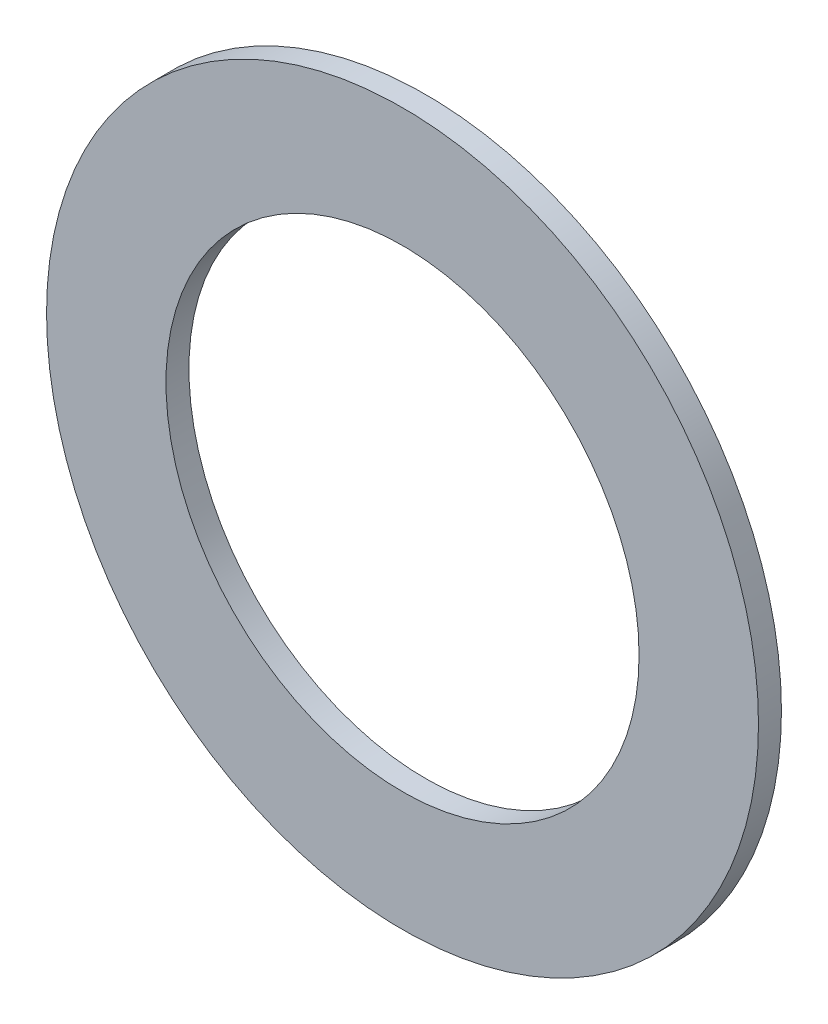
ISO-10303-21;
HEADER;
FILE_DESCRIPTION(('STEP AP214'),'2;1');
FILE_NAME('part.step','',(''),(''),'','','');
FILE_SCHEMA(('AUTOMOTIVE_DESIGN { 1 0 10303 214 1 1 1 1 }'));
ENDSEC;
DATA;
#1=APPLICATION_CONTEXT('core data for automotive mechanical design processes');
#2=APPLICATION_PROTOCOL_DEFINITION('international standard','automotive_design',2000,#1);
#3=PRODUCT_CONTEXT('',#1,'mechanical');
#4=PRODUCT('Part','Part','',(#3));
#5=PRODUCT_RELATED_PRODUCT_CATEGORY('part','',(#4));
#6=PRODUCT_DEFINITION_FORMATION('','',#4);
#7=PRODUCT_DEFINITION_CONTEXT('part definition',#1,'design');
#8=PRODUCT_DEFINITION('design','',#6,#7);
#9=PRODUCT_DEFINITION_SHAPE('','',#8);
#10=(LENGTH_UNIT() NAMED_UNIT(*) SI_UNIT(.MILLI.,.METRE.));
#11=(NAMED_UNIT(*) PLANE_ANGLE_UNIT() SI_UNIT($,.RADIAN.));
#12=(NAMED_UNIT(*) SI_UNIT($,.STERADIAN.) SOLID_ANGLE_UNIT());
#13=UNCERTAINTY_MEASURE_WITH_UNIT(LENGTH_MEASURE(1.E-05),#10,'distance_accuracy_value','');
#14=(GEOMETRIC_REPRESENTATION_CONTEXT(3) GLOBAL_UNCERTAINTY_ASSIGNED_CONTEXT((#13)) GLOBAL_UNIT_ASSIGNED_CONTEXT((#10,
#11,#12)) REPRESENTATION_CONTEXT('',''));
#15=CARTESIAN_POINT('',(0.,0.,0.));
#16=DIRECTION('',(0.,0.,1.));
#17=DIRECTION('',(1.,0.,0.));
#18=AXIS2_PLACEMENT_3D('',#15,#16,#17);
#19=CARTESIAN_POINT('',(0.,2.6162,0.));
#20=DIRECTION('',(0.,0.,-1.));
#21=DIRECTION('',(-1.,0.,0.));
#22=AXIS2_PLACEMENT_3D('',#19,#20,#21);
#23=PLANE('',#22);
#24=CARTESIAN_POINT('',(0.,0.,0.));
#25=DIRECTION('',(0.,0.,1.));
#26=DIRECTION('',(1.,0.,0.));
#27=AXIS2_PLACEMENT_3D('',#24,#25,#26);
#28=CIRCLE('',#27,2.6162);
#29=CARTESIAN_POINT('',(2.6162,0.,0.));
#30=VERTEX_POINT('',#29);
#31=EDGE_CURVE('E46',#30,#30,#28,.T.);
#32=ORIENTED_EDGE('',*,*,#31,.F.);
#33=EDGE_LOOP('',(#32));
#34=FACE_BOUND('',#33,.T.);
#35=CARTESIAN_POINT('',(0.,0.,0.));
#36=DIRECTION('',(0.,0.,1.));
#37=DIRECTION('',(1.,0.,0.));
#38=AXIS2_PLACEMENT_3D('',#35,#36,#37);
#39=CIRCLE('',#38,3.937);
#40=CARTESIAN_POINT('',(3.937,0.,0.));
#41=VERTEX_POINT('',#40);
#42=EDGE_CURVE('E10',#41,#41,#39,.T.);
#43=ORIENTED_EDGE('',*,*,#42,.T.);
#44=EDGE_LOOP('',(#43));
#45=FACE_BOUND('',#44,.T.);
#46=ADVANCED_FACE('F32',(#34,#45),#23,.F.);
#47=CARTESIAN_POINT('',(0.,0.,5.22059457605704));
#48=DIRECTION('',(0.,0.,1.));
#49=DIRECTION('',(1.,0.,0.));
#50=AXIS2_PLACEMENT_3D('',#47,#48,#49);
#51=CYLINDRICAL_SURFACE('',#50,3.937);
#52=ORIENTED_EDGE('',*,*,#42,.F.);
#53=EDGE_LOOP('',(#52));
#54=FACE_BOUND('',#53,.T.);
#55=CARTESIAN_POINT('',(0.,0.,-0.254));
#56=DIRECTION('',(0.,0.,1.));
#57=DIRECTION('',(1.,0.,0.));
#58=AXIS2_PLACEMENT_3D('',#55,#56,#57);
#59=CIRCLE('',#58,3.937);
#60=CARTESIAN_POINT('',(3.937,0.,-0.254));
#61=VERTEX_POINT('',#60);
#62=EDGE_CURVE('E38',#61,#61,#59,.T.);
#63=ORIENTED_EDGE('',*,*,#62,.T.);
#64=EDGE_LOOP('',(#63));
#65=FACE_BOUND('',#64,.T.);
#66=ADVANCED_FACE('F55',(#54,#65),#51,.T.);
#67=CARTESIAN_POINT('',(0.,2.6162,-0.254));
#68=DIRECTION('',(0.,0.,1.));
#69=DIRECTION('',(1.,0.,0.));
#70=AXIS2_PLACEMENT_3D('',#67,#68,#69);
#71=PLANE('',#70);
#72=ORIENTED_EDGE('',*,*,#62,.F.);
#73=EDGE_LOOP('',(#72));
#74=FACE_BOUND('',#73,.T.);
#75=CARTESIAN_POINT('',(0.,0.,-0.254));
#76=DIRECTION('',(0.,0.,1.));
#77=DIRECTION('',(1.,0.,0.));
#78=AXIS2_PLACEMENT_3D('',#75,#76,#77);
#79=CIRCLE('',#78,2.6162);
#80=CARTESIAN_POINT('',(2.6162,0.,-0.254));
#81=VERTEX_POINT('',#80);
#82=EDGE_CURVE('E42',#81,#81,#79,.T.);
#83=ORIENTED_EDGE('',*,*,#82,.T.);
#84=EDGE_LOOP('',(#83));
#85=FACE_BOUND('',#84,.T.);
#86=ADVANCED_FACE('F59',(#74,#85),#71,.F.);
#87=CARTESIAN_POINT('',(0.,0.,5.22059457605704));
#88=DIRECTION('',(0.,0.,1.));
#89=DIRECTION('',(1.,0.,0.));
#90=AXIS2_PLACEMENT_3D('',#87,#88,#89);
#91=CYLINDRICAL_SURFACE('',#90,2.6162);
#92=ORIENTED_EDGE('',*,*,#82,.F.);
#93=EDGE_LOOP('',(#92));
#94=FACE_BOUND('',#93,.T.);
#95=ORIENTED_EDGE('',*,*,#31,.T.);
#96=EDGE_LOOP('',(#95));
#97=FACE_BOUND('',#96,.T.);
#98=ADVANCED_FACE('F52',(#94,#97),#91,.F.);
#99=CLOSED_SHELL('',(#46,#66,#86,#98));
#100=MANIFOLD_SOLID_BREP('B2',#99);
#101=ADVANCED_BREP_SHAPE_REPRESENTATION('',(#18,#100),#14);
#102=SHAPE_DEFINITION_REPRESENTATION(#9,#101);
ENDSEC;
END-ISO-10303-21;
